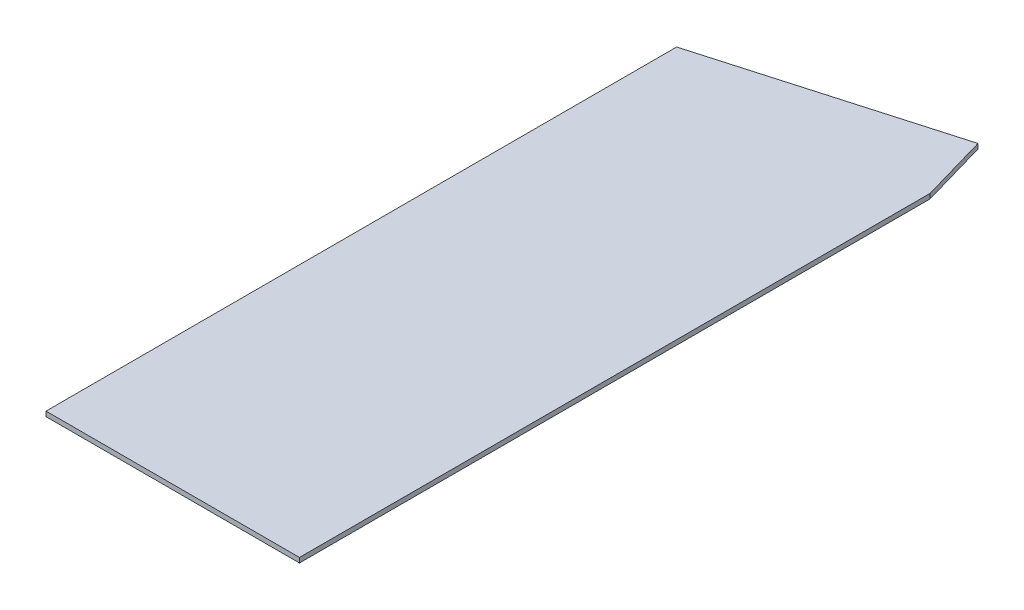
ISO-10303-21;
HEADER;
FILE_DESCRIPTION(('STEP AP214'),'2;1');
FILE_NAME('part.step','',(''),(''),'','','');
FILE_SCHEMA(('AUTOMOTIVE_DESIGN { 1 0 10303 214 1 1 1 1 }'));
ENDSEC;
DATA;
#1=APPLICATION_CONTEXT('core data for automotive mechanical design processes');
#2=APPLICATION_PROTOCOL_DEFINITION('international standard','automotive_design',2000,#1);
#3=PRODUCT_CONTEXT('',#1,'mechanical');
#4=PRODUCT('Part','Part','',(#3));
#5=PRODUCT_RELATED_PRODUCT_CATEGORY('part','',(#4));
#6=PRODUCT_DEFINITION_FORMATION('','',#4);
#7=PRODUCT_DEFINITION_CONTEXT('part definition',#1,'design');
#8=PRODUCT_DEFINITION('design','',#6,#7);
#9=PRODUCT_DEFINITION_SHAPE('','',#8);
#10=(LENGTH_UNIT() NAMED_UNIT(*) SI_UNIT(.MILLI.,.METRE.));
#11=(NAMED_UNIT(*) PLANE_ANGLE_UNIT() SI_UNIT($,.RADIAN.));
#12=(NAMED_UNIT(*) SI_UNIT($,.STERADIAN.) SOLID_ANGLE_UNIT());
#13=UNCERTAINTY_MEASURE_WITH_UNIT(LENGTH_MEASURE(1.E-05),#10,'distance_accuracy_value','');
#14=(GEOMETRIC_REPRESENTATION_CONTEXT(3) GLOBAL_UNCERTAINTY_ASSIGNED_CONTEXT((#13)) GLOBAL_UNIT_ASSIGNED_CONTEXT((#10,
#11,#12)) REPRESENTATION_CONTEXT('',''));
#15=CARTESIAN_POINT('',(0.,0.,0.));
#16=DIRECTION('',(0.,0.,1.));
#17=DIRECTION('',(1.,0.,0.));
#18=AXIS2_PLACEMENT_3D('',#15,#16,#17);
#19=CARTESIAN_POINT('',(210.,4.,-522.5));
#20=DIRECTION('',(-1.,0.,0.));
#21=DIRECTION('',(0.,0.,-1.));
#22=AXIS2_PLACEMENT_3D('',#19,#20,#21);
#23=PLANE('',#22);
#24=DIRECTION('',(0.,0.,1.));
#25=VECTOR('',#24,1.);
#26=CARTESIAN_POINT('',(210.,-4.,-522.5));
#27=LINE('',#26,#25);
#28=CARTESIAN_POINT('',(210.,-4.,-522.5));
#29=VERTEX_POINT('',#28);
#30=CARTESIAN_POINT('',(210.,-4.,522.5));
#31=VERTEX_POINT('',#30);
#32=EDGE_CURVE('E96',#29,#31,#27,.T.);
#33=ORIENTED_EDGE('',*,*,#32,.F.);
#34=DIRECTION('',(0.,-1.,0.));
#35=VECTOR('',#34,1.);
#36=CARTESIAN_POINT('',(210.,4.,-522.5));
#37=LINE('',#36,#35);
#38=CARTESIAN_POINT('',(210.,4.,-522.5));
#39=VERTEX_POINT('',#38);
#40=EDGE_CURVE('E117',#39,#29,#37,.T.);
#41=ORIENTED_EDGE('',*,*,#40,.F.);
#42=DIRECTION('',(0.,0.,1.));
#43=VECTOR('',#42,1.);
#44=CARTESIAN_POINT('',(210.,4.,-522.5));
#45=LINE('',#44,#43);
#46=CARTESIAN_POINT('',(210.,4.,522.5));
#47=VERTEX_POINT('',#46);
#48=EDGE_CURVE('E106',#39,#47,#45,.T.);
#49=ORIENTED_EDGE('',*,*,#48,.T.);
#50=DIRECTION('',(0.,-1.,0.));
#51=VECTOR('',#50,1.);
#52=CARTESIAN_POINT('',(210.,4.,522.5));
#53=LINE('',#52,#51);
#54=EDGE_CURVE('E11',#47,#31,#53,.T.);
#55=ORIENTED_EDGE('',*,*,#54,.T.);
#56=EDGE_LOOP('',(#33,#41,#49,#55));
#57=FACE_BOUND('',#56,.T.);
#58=ADVANCED_FACE('F37',(#57),#23,.F.);
#59=CARTESIAN_POINT('',(-210.,4.,522.5));
#60=DIRECTION('',(0.,0.,-1.));
#61=DIRECTION('',(1.,0.,0.));
#62=AXIS2_PLACEMENT_3D('',#59,#60,#61);
#63=PLANE('',#62);
#64=DIRECTION('',(-1.,0.,0.));
#65=VECTOR('',#64,1.);
#66=CARTESIAN_POINT('',(-210.,-4.,522.5));
#67=LINE('',#66,#65);
#68=CARTESIAN_POINT('',(-210.,-4.,522.5));
#69=VERTEX_POINT('',#68);
#70=EDGE_CURVE('E119',#31,#69,#67,.T.);
#71=ORIENTED_EDGE('',*,*,#70,.F.);
#72=ORIENTED_EDGE('',*,*,#54,.F.);
#73=DIRECTION('',(-1.,0.,0.));
#74=VECTOR('',#73,1.);
#75=CARTESIAN_POINT('',(-210.,4.,522.5));
#76=LINE('',#75,#74);
#77=CARTESIAN_POINT('',(-210.,4.,522.5));
#78=VERTEX_POINT('',#77);
#79=EDGE_CURVE('E83',#47,#78,#76,.T.);
#80=ORIENTED_EDGE('',*,*,#79,.T.);
#81=DIRECTION('',(0.,-1.,0.));
#82=VECTOR('',#81,1.);
#83=CARTESIAN_POINT('',(-210.,4.,522.5));
#84=LINE('',#83,#82);
#85=EDGE_CURVE('E45',#78,#69,#84,.T.);
#86=ORIENTED_EDGE('',*,*,#85,.T.);
#87=EDGE_LOOP('',(#71,#72,#80,#86));
#88=FACE_BOUND('',#87,.T.);
#89=ADVANCED_FACE('F125',(#88),#63,.F.);
#90=CARTESIAN_POINT('',(-210.,4.,-522.5));
#91=DIRECTION('',(1.,0.,0.));
#92=DIRECTION('',(0.,0.,1.));
#93=AXIS2_PLACEMENT_3D('',#90,#91,#92);
#94=PLANE('',#93);
#95=DIRECTION('',(0.,0.,-1.));
#96=VECTOR('',#95,1.);
#97=CARTESIAN_POINT('',(-210.,-4.,-522.5));
#98=LINE('',#97,#96);
#99=CARTESIAN_POINT('',(-210.,-4.,-522.5));
#100=VERTEX_POINT('',#99);
#101=EDGE_CURVE('E69',#69,#100,#98,.T.);
#102=ORIENTED_EDGE('',*,*,#101,.F.);
#103=ORIENTED_EDGE('',*,*,#85,.F.);
#104=DIRECTION('',(0.,0.,-1.));
#105=VECTOR('',#104,1.);
#106=CARTESIAN_POINT('',(-210.,4.,-522.5));
#107=LINE('',#106,#105);
#108=CARTESIAN_POINT('',(-210.,4.,-522.5));
#109=VERTEX_POINT('',#108);
#110=EDGE_CURVE('E115',#78,#109,#107,.T.);
#111=ORIENTED_EDGE('',*,*,#110,.T.);
#112=DIRECTION('',(0.,-1.,0.));
#113=VECTOR('',#112,1.);
#114=CARTESIAN_POINT('',(-210.,4.,-522.5));
#115=LINE('',#114,#113);
#116=EDGE_CURVE('E101',#109,#100,#115,.T.);
#117=ORIENTED_EDGE('',*,*,#116,.T.);
#118=EDGE_LOOP('',(#102,#103,#111,#117));
#119=FACE_BOUND('',#118,.T.);
#120=ADVANCED_FACE('F133',(#119),#94,.F.);
#121=CARTESIAN_POINT('',(0.,4.,0.));
#122=DIRECTION('',(0.,-1.,0.));
#123=DIRECTION('',(0.,0.,1.));
#124=AXIS2_PLACEMENT_3D('',#121,#122,#123);
#125=PLANE('',#124);
#126=ORIENTED_EDGE('',*,*,#48,.F.);
#127=DIRECTION('',(0.275637355817,0.,0.961261695938319));
#128=VECTOR('',#127,1.);
#129=CARTESIAN_POINT('',(178.090100192849,4.,-633.783045488973));
#130=LINE('',#129,#128);
#131=CARTESIAN_POINT('',(178.090100192849,4.,-633.783045488973));
#132=VERTEX_POINT('',#131);
#133=EDGE_CURVE('E53',#132,#39,#130,.T.);
#134=ORIENTED_EDGE('',*,*,#133,.F.);
#135=DIRECTION('',(0.961261695938319,0.,-0.275637355817));
#136=VECTOR('',#135,1.);
#137=CARTESIAN_POINT('',(-210.,4.,-522.5));
#138=LINE('',#137,#136);
#139=EDGE_CURVE('E99',#109,#132,#138,.T.);
#140=ORIENTED_EDGE('',*,*,#139,.F.);
#141=ORIENTED_EDGE('',*,*,#110,.F.);
#142=ORIENTED_EDGE('',*,*,#79,.F.);
#143=EDGE_LOOP('',(#126,#134,#140,#141,#142));
#144=FACE_BOUND('',#143,.T.);
#145=ADVANCED_FACE('F104',(#144),#125,.F.);
#146=CARTESIAN_POINT('',(0.,-4.,0.));
#147=DIRECTION('',(0.,-1.,0.));
#148=DIRECTION('',(0.,0.,1.));
#149=AXIS2_PLACEMENT_3D('',#146,#147,#148);
#150=PLANE('',#149);
#151=ORIENTED_EDGE('',*,*,#32,.T.);
#152=ORIENTED_EDGE('',*,*,#70,.T.);
#153=ORIENTED_EDGE('',*,*,#101,.T.);
#154=DIRECTION('',(0.961261695938319,0.,-0.275637355817));
#155=VECTOR('',#154,1.);
#156=CARTESIAN_POINT('',(-210.,-4.,-522.5));
#157=LINE('',#156,#155);
#158=CARTESIAN_POINT('',(178.090100192849,-4.,-633.783045488973));
#159=VERTEX_POINT('',#158);
#160=EDGE_CURVE('E108',#100,#159,#157,.T.);
#161=ORIENTED_EDGE('',*,*,#160,.T.);
#162=DIRECTION('',(0.275637355817,0.,0.961261695938319));
#163=VECTOR('',#162,1.);
#164=CARTESIAN_POINT('',(178.090100192849,-4.,-633.783045488973));
#165=LINE('',#164,#163);
#166=EDGE_CURVE('E77',#159,#29,#165,.T.);
#167=ORIENTED_EDGE('',*,*,#166,.T.);
#168=EDGE_LOOP('',(#151,#152,#153,#161,#167));
#169=FACE_BOUND('',#168,.T.);
#170=ADVANCED_FACE('F126',(#169),#150,.T.);
#171=CARTESIAN_POINT('',(178.090100192849,-4.,-633.783045488973));
#172=DIRECTION('',(0.961261695938319,0.,-0.275637355817));
#173=DIRECTION('',(0.275637355817,0.,0.961261695938319));
#174=AXIS2_PLACEMENT_3D('',#171,#172,#173);
#175=PLANE('',#174);
#176=ORIENTED_EDGE('',*,*,#40,.T.);
#177=ORIENTED_EDGE('',*,*,#166,.F.);
#178=DIRECTION('',(0.,1.,0.));
#179=VECTOR('',#178,1.);
#180=CARTESIAN_POINT('',(178.090100192849,-4.,-633.783045488973));
#181=LINE('',#180,#179);
#182=EDGE_CURVE('E92',#159,#132,#181,.T.);
#183=ORIENTED_EDGE('',*,*,#182,.T.);
#184=ORIENTED_EDGE('',*,*,#133,.T.);
#185=EDGE_LOOP('',(#176,#177,#183,#184));
#186=FACE_BOUND('',#185,.T.);
#187=ADVANCED_FACE('F94',(#186),#175,.T.);
#188=CARTESIAN_POINT('',(-210.,-4.,-522.5));
#189=DIRECTION('',(-0.275637355817,0.,-0.961261695938319));
#190=DIRECTION('',(0.961261695938319,0.,-0.275637355817));
#191=AXIS2_PLACEMENT_3D('',#188,#189,#190);
#192=PLANE('',#191);
#193=ORIENTED_EDGE('',*,*,#182,.F.);
#194=ORIENTED_EDGE('',*,*,#160,.F.);
#195=ORIENTED_EDGE('',*,*,#116,.F.);
#196=ORIENTED_EDGE('',*,*,#139,.T.);
#197=EDGE_LOOP('',(#193,#194,#195,#196));
#198=FACE_BOUND('',#197,.T.);
#199=ADVANCED_FACE('F100',(#198),#192,.T.);
#200=CLOSED_SHELL('',(#58,#89,#120,#145,#170,#187,#199));
#201=MANIFOLD_SOLID_BREP('B2',#200);
#202=ADVANCED_BREP_SHAPE_REPRESENTATION('',(#18,#201),#14);
#203=SHAPE_DEFINITION_REPRESENTATION(#9,#202);
ENDSEC;
END-ISO-10303-21;
